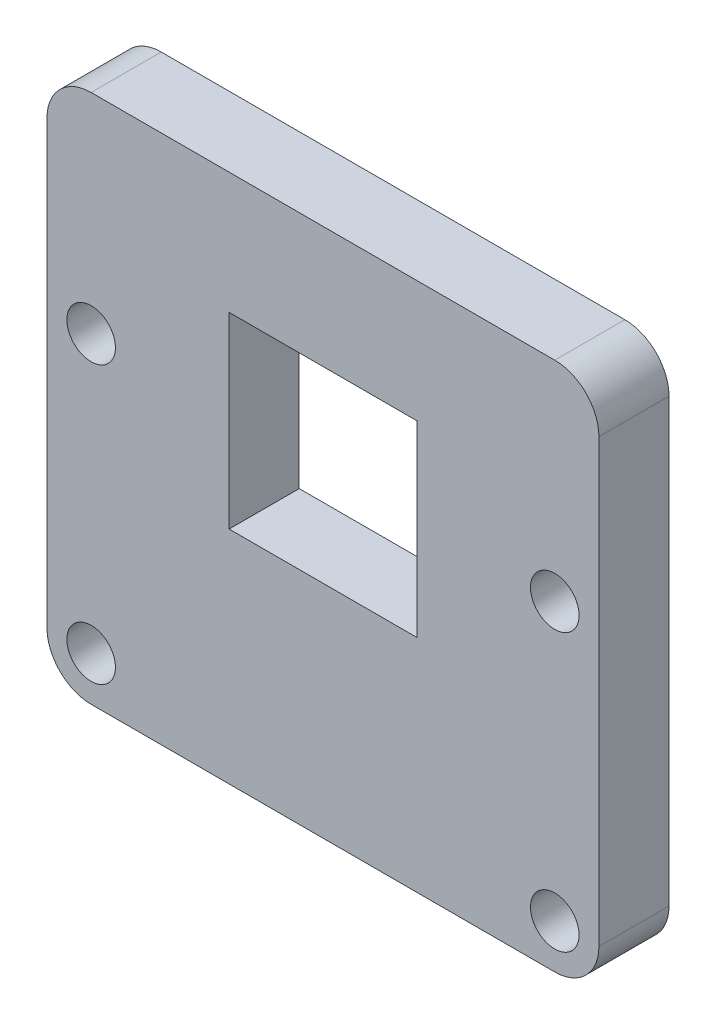
ISO-10303-21;
HEADER;
FILE_DESCRIPTION(('STEP AP214'),'2;1');
FILE_NAME('part.step','',(''),(''),'','','');
FILE_SCHEMA(('AUTOMOTIVE_DESIGN { 1 0 10303 214 1 1 1 1 }'));
ENDSEC;
DATA;
#1=APPLICATION_CONTEXT('core data for automotive mechanical design processes');
#2=APPLICATION_PROTOCOL_DEFINITION('international standard','automotive_design',2000,#1);
#3=PRODUCT_CONTEXT('',#1,'mechanical');
#4=PRODUCT('Part','Part','',(#3));
#5=PRODUCT_RELATED_PRODUCT_CATEGORY('part','',(#4));
#6=PRODUCT_DEFINITION_FORMATION('','',#4);
#7=PRODUCT_DEFINITION_CONTEXT('part definition',#1,'design');
#8=PRODUCT_DEFINITION('design','',#6,#7);
#9=PRODUCT_DEFINITION_SHAPE('','',#8);
#10=(LENGTH_UNIT() NAMED_UNIT(*) SI_UNIT(.MILLI.,.METRE.));
#11=(NAMED_UNIT(*) PLANE_ANGLE_UNIT() SI_UNIT($,.RADIAN.));
#12=(NAMED_UNIT(*) SI_UNIT($,.STERADIAN.) SOLID_ANGLE_UNIT());
#13=UNCERTAINTY_MEASURE_WITH_UNIT(LENGTH_MEASURE(1.E-05),#10,'distance_accuracy_value','');
#14=(GEOMETRIC_REPRESENTATION_CONTEXT(3) GLOBAL_UNCERTAINTY_ASSIGNED_CONTEXT((#13)) GLOBAL_UNIT_ASSIGNED_CONTEXT((#10,
#11,#12)) REPRESENTATION_CONTEXT('',''));
#15=CARTESIAN_POINT('',(0.,0.,0.));
#16=DIRECTION('',(0.,0.,1.));
#17=DIRECTION('',(1.,0.,0.));
#18=AXIS2_PLACEMENT_3D('',#15,#16,#17);
#19=CARTESIAN_POINT('',(-10.7053326435815,-14.9284893275787,-3.175));
#20=DIRECTION('',(0.,0.,1.));
#21=DIRECTION('',(1.,0.,0.));
#22=AXIS2_PLACEMENT_3D('',#19,#20,#21);
#23=CYLINDRICAL_SURFACE('',#22,2.);
#24=CARTESIAN_POINT('',(-10.7053326435815,-14.9284893275787,0.));
#25=DIRECTION('',(0.,0.,1.));
#26=DIRECTION('',(1.,0.,0.));
#27=AXIS2_PLACEMENT_3D('',#24,#25,#26);
#28=CIRCLE('',#27,2.);
#29=CARTESIAN_POINT('',(-12.7053326435815,-14.9284893275787,0.));
#30=VERTEX_POINT('',#29);
#31=CARTESIAN_POINT('',(-10.7053326435815,-16.9284893275787,0.));
#32=VERTEX_POINT('',#31);
#33=EDGE_CURVE('E206',#30,#32,#28,.T.);
#34=ORIENTED_EDGE('',*,*,#33,.F.);
#35=DIRECTION('',(0.,0.,1.));
#36=VECTOR('',#35,1.);
#37=CARTESIAN_POINT('',(-12.7053326435815,-14.9284893275787,-3.175));
#38=LINE('',#37,#36);
#39=CARTESIAN_POINT('',(-12.7053326435815,-14.9284893275787,-3.175));
#40=VERTEX_POINT('',#39);
#41=EDGE_CURVE('E11',#40,#30,#38,.T.);
#42=ORIENTED_EDGE('',*,*,#41,.F.);
#43=CARTESIAN_POINT('',(-10.7053326435815,-14.9284893275787,-3.175));
#44=DIRECTION('',(0.,0.,1.));
#45=DIRECTION('',(1.,0.,0.));
#46=AXIS2_PLACEMENT_3D('',#43,#44,#45);
#47=CIRCLE('',#46,2.);
#48=CARTESIAN_POINT('',(-10.7053326435815,-16.9284893275787,-3.175));
#49=VERTEX_POINT('',#48);
#50=EDGE_CURVE('E210',#40,#49,#47,.T.);
#51=ORIENTED_EDGE('',*,*,#50,.T.);
#52=DIRECTION('',(0.,0.,1.));
#53=VECTOR('',#52,1.);
#54=CARTESIAN_POINT('',(-10.7053326435815,-16.9284893275787,-3.175));
#55=LINE('',#54,#53);
#56=EDGE_CURVE('E42',#49,#32,#55,.T.);
#57=ORIENTED_EDGE('',*,*,#56,.T.);
#58=EDGE_LOOP('',(#34,#42,#51,#57));
#59=FACE_BOUND('',#58,.T.);
#60=ADVANCED_FACE('F39',(#59),#23,.T.);
#61=CARTESIAN_POINT('',(-12.7053326435815,5.07151067242124,-3.175));
#62=DIRECTION('',(-1.,0.,0.));
#63=DIRECTION('',(0.,-1.,0.));
#64=AXIS2_PLACEMENT_3D('',#61,#62,#63);
#65=PLANE('',#64);
#66=DIRECTION('',(0.,-1.,0.));
#67=VECTOR('',#66,1.);
#68=CARTESIAN_POINT('',(-12.7053326435815,5.07151067242124,0.));
#69=LINE('',#68,#67);
#70=CARTESIAN_POINT('',(-12.7053326435815,5.07151067242124,0.));
#71=VERTEX_POINT('',#70);
#72=EDGE_CURVE('E215',#71,#30,#69,.T.);
#73=ORIENTED_EDGE('',*,*,#72,.F.);
#74=DIRECTION('',(0.,0.,1.));
#75=VECTOR('',#74,1.);
#76=CARTESIAN_POINT('',(-12.7053326435815,5.07151067242124,-3.175));
#77=LINE('',#76,#75);
#78=CARTESIAN_POINT('',(-12.7053326435815,5.07151067242124,-3.175));
#79=VERTEX_POINT('',#78);
#80=EDGE_CURVE('E48',#79,#71,#77,.T.);
#81=ORIENTED_EDGE('',*,*,#80,.F.);
#82=DIRECTION('',(0.,-1.,0.));
#83=VECTOR('',#82,1.);
#84=CARTESIAN_POINT('',(-12.7053326435815,5.07151067242124,-3.175));
#85=LINE('',#84,#83);
#86=EDGE_CURVE('E239',#79,#40,#85,.T.);
#87=ORIENTED_EDGE('',*,*,#86,.T.);
#88=ORIENTED_EDGE('',*,*,#41,.T.);
#89=EDGE_LOOP('',(#73,#81,#87,#88));
#90=FACE_BOUND('',#89,.T.);
#91=ADVANCED_FACE('F302',(#90),#65,.T.);
#92=CARTESIAN_POINT('',(-10.7053326435815,5.07151067242125,-3.175));
#93=DIRECTION('',(0.,0.,1.));
#94=DIRECTION('',(1.,0.,0.));
#95=AXIS2_PLACEMENT_3D('',#92,#93,#94);
#96=CYLINDRICAL_SURFACE('',#95,2.);
#97=CARTESIAN_POINT('',(-10.7053326435815,5.07151067242125,0.));
#98=DIRECTION('',(0.,0.,1.));
#99=DIRECTION('',(1.,0.,0.));
#100=AXIS2_PLACEMENT_3D('',#97,#98,#99);
#101=CIRCLE('',#100,2.);
#102=CARTESIAN_POINT('',(-10.7053326435815,7.07151067242125,0.));
#103=VERTEX_POINT('',#102);
#104=EDGE_CURVE('E266',#103,#71,#101,.T.);
#105=ORIENTED_EDGE('',*,*,#104,.F.);
#106=DIRECTION('',(0.,0.,1.));
#107=VECTOR('',#106,1.);
#108=CARTESIAN_POINT('',(-10.7053326435815,7.07151067242125,-3.175));
#109=LINE('',#108,#107);
#110=CARTESIAN_POINT('',(-10.7053326435815,7.07151067242125,-3.175));
#111=VERTEX_POINT('',#110);
#112=EDGE_CURVE('E275',#111,#103,#109,.T.);
#113=ORIENTED_EDGE('',*,*,#112,.F.);
#114=CARTESIAN_POINT('',(-10.7053326435815,5.07151067242125,-3.175));
#115=DIRECTION('',(0.,0.,1.));
#116=DIRECTION('',(1.,0.,0.));
#117=AXIS2_PLACEMENT_3D('',#114,#115,#116);
#118=CIRCLE('',#117,2.);
#119=EDGE_CURVE('E235',#111,#79,#118,.T.);
#120=ORIENTED_EDGE('',*,*,#119,.T.);
#121=ORIENTED_EDGE('',*,*,#80,.T.);
#122=EDGE_LOOP('',(#105,#113,#120,#121));
#123=FACE_BOUND('',#122,.T.);
#124=ADVANCED_FACE('F322',(#123),#96,.T.);
#125=CARTESIAN_POINT('',(-10.7053326435815,7.07151067242125,-3.175));
#126=DIRECTION('',(0.,1.,0.));
#127=DIRECTION('',(0.,0.,1.));
#128=AXIS2_PLACEMENT_3D('',#125,#126,#127);
#129=PLANE('',#128);
#130=DIRECTION('',(-1.,0.,0.));
#131=VECTOR('',#130,1.);
#132=CARTESIAN_POINT('',(-10.7053326435815,7.07151067242125,0.));
#133=LINE('',#132,#131);
#134=CARTESIAN_POINT('',(10.2946673564185,7.07151067242125,0.));
#135=VERTEX_POINT('',#134);
#136=EDGE_CURVE('E262',#135,#103,#133,.T.);
#137=ORIENTED_EDGE('',*,*,#136,.F.);
#138=DIRECTION('',(0.,0.,1.));
#139=VECTOR('',#138,1.);
#140=CARTESIAN_POINT('',(10.2946673564185,7.07151067242125,-3.175));
#141=LINE('',#140,#139);
#142=CARTESIAN_POINT('',(10.2946673564185,7.07151067242125,-3.175));
#143=VERTEX_POINT('',#142);
#144=EDGE_CURVE('E278',#143,#135,#141,.T.);
#145=ORIENTED_EDGE('',*,*,#144,.F.);
#146=DIRECTION('',(-1.,0.,0.));
#147=VECTOR('',#146,1.);
#148=CARTESIAN_POINT('',(-10.7053326435815,7.07151067242125,-3.175));
#149=LINE('',#148,#147);
#150=EDGE_CURVE('E231',#143,#111,#149,.T.);
#151=ORIENTED_EDGE('',*,*,#150,.T.);
#152=ORIENTED_EDGE('',*,*,#112,.T.);
#153=EDGE_LOOP('',(#137,#145,#151,#152));
#154=FACE_BOUND('',#153,.T.);
#155=ADVANCED_FACE('F320',(#154),#129,.T.);
#156=CARTESIAN_POINT('',(10.2946673564185,5.07151067242125,-3.175));
#157=DIRECTION('',(0.,0.,1.));
#158=DIRECTION('',(1.,0.,0.));
#159=AXIS2_PLACEMENT_3D('',#156,#157,#158);
#160=CYLINDRICAL_SURFACE('',#159,2.);
#161=CARTESIAN_POINT('',(10.2946673564185,5.07151067242125,0.));
#162=DIRECTION('',(0.,0.,1.));
#163=DIRECTION('',(-1.,0.,0.));
#164=AXIS2_PLACEMENT_3D('',#161,#162,#163);
#165=CIRCLE('',#164,2.);
#166=CARTESIAN_POINT('',(12.2946673564185,5.07151067242124,0.));
#167=VERTEX_POINT('',#166);
#168=EDGE_CURVE('E258',#167,#135,#165,.T.);
#169=ORIENTED_EDGE('',*,*,#168,.F.);
#170=DIRECTION('',(0.,0.,1.));
#171=VECTOR('',#170,1.);
#172=CARTESIAN_POINT('',(12.2946673564185,5.07151067242124,-3.175));
#173=LINE('',#172,#171);
#174=CARTESIAN_POINT('',(12.2946673564185,5.07151067242124,-3.175));
#175=VERTEX_POINT('',#174);
#176=EDGE_CURVE('E281',#175,#167,#173,.T.);
#177=ORIENTED_EDGE('',*,*,#176,.F.);
#178=CARTESIAN_POINT('',(10.2946673564185,5.07151067242125,-3.175));
#179=DIRECTION('',(0.,0.,1.));
#180=DIRECTION('',(-1.,0.,0.));
#181=AXIS2_PLACEMENT_3D('',#178,#179,#180);
#182=CIRCLE('',#181,2.);
#183=EDGE_CURVE('E227',#175,#143,#182,.T.);
#184=ORIENTED_EDGE('',*,*,#183,.T.);
#185=ORIENTED_EDGE('',*,*,#144,.T.);
#186=EDGE_LOOP('',(#169,#177,#184,#185));
#187=FACE_BOUND('',#186,.T.);
#188=ADVANCED_FACE('F316',(#187),#160,.T.);
#189=CARTESIAN_POINT('',(12.2946673564185,5.07151067242124,-3.175));
#190=DIRECTION('',(1.,0.,0.));
#191=DIRECTION('',(0.,1.,0.));
#192=AXIS2_PLACEMENT_3D('',#189,#190,#191);
#193=PLANE('',#192);
#194=DIRECTION('',(0.,1.,0.));
#195=VECTOR('',#194,1.);
#196=CARTESIAN_POINT('',(12.2946673564185,5.07151067242124,0.));
#197=LINE('',#196,#195);
#198=CARTESIAN_POINT('',(12.2946673564185,-14.9284893275787,0.));
#199=VERTEX_POINT('',#198);
#200=EDGE_CURVE('E254',#199,#167,#197,.T.);
#201=ORIENTED_EDGE('',*,*,#200,.F.);
#202=DIRECTION('',(0.,0.,1.));
#203=VECTOR('',#202,1.);
#204=CARTESIAN_POINT('',(12.2946673564185,-14.9284893275787,-3.175));
#205=LINE('',#204,#203);
#206=CARTESIAN_POINT('',(12.2946673564185,-14.9284893275787,-3.175));
#207=VERTEX_POINT('',#206);
#208=EDGE_CURVE('E284',#207,#199,#205,.T.);
#209=ORIENTED_EDGE('',*,*,#208,.F.);
#210=DIRECTION('',(0.,1.,0.));
#211=VECTOR('',#210,1.);
#212=CARTESIAN_POINT('',(12.2946673564185,5.07151067242124,-3.175));
#213=LINE('',#212,#211);
#214=EDGE_CURVE('E223',#207,#175,#213,.T.);
#215=ORIENTED_EDGE('',*,*,#214,.T.);
#216=ORIENTED_EDGE('',*,*,#176,.T.);
#217=EDGE_LOOP('',(#201,#209,#215,#216));
#218=FACE_BOUND('',#217,.T.);
#219=ADVANCED_FACE('F314',(#218),#193,.T.);
#220=CARTESIAN_POINT('',(10.2946673564185,-14.9284893275787,-3.175));
#221=DIRECTION('',(0.,0.,1.));
#222=DIRECTION('',(1.,0.,0.));
#223=AXIS2_PLACEMENT_3D('',#220,#221,#222);
#224=CYLINDRICAL_SURFACE('',#223,2.);
#225=CARTESIAN_POINT('',(10.2946673564185,-14.9284893275787,0.));
#226=DIRECTION('',(0.,0.,1.));
#227=DIRECTION('',(1.,0.,0.));
#228=AXIS2_PLACEMENT_3D('',#225,#226,#227);
#229=CIRCLE('',#228,2.);
#230=CARTESIAN_POINT('',(10.2946673564185,-16.9284893275787,0.));
#231=VERTEX_POINT('',#230);
#232=EDGE_CURVE('E250',#231,#199,#229,.T.);
#233=ORIENTED_EDGE('',*,*,#232,.F.);
#234=DIRECTION('',(0.,0.,1.));
#235=VECTOR('',#234,1.);
#236=CARTESIAN_POINT('',(10.2946673564185,-16.9284893275787,-3.175));
#237=LINE('',#236,#235);
#238=CARTESIAN_POINT('',(10.2946673564185,-16.9284893275787,-3.175));
#239=VERTEX_POINT('',#238);
#240=EDGE_CURVE('E286',#239,#231,#237,.T.);
#241=ORIENTED_EDGE('',*,*,#240,.F.);
#242=CARTESIAN_POINT('',(10.2946673564185,-14.9284893275787,-3.175));
#243=DIRECTION('',(0.,0.,1.));
#244=DIRECTION('',(1.,0.,0.));
#245=AXIS2_PLACEMENT_3D('',#242,#243,#244);
#246=CIRCLE('',#245,2.);
#247=EDGE_CURVE('E219',#239,#207,#246,.T.);
#248=ORIENTED_EDGE('',*,*,#247,.T.);
#249=ORIENTED_EDGE('',*,*,#208,.T.);
#250=EDGE_LOOP('',(#233,#241,#248,#249));
#251=FACE_BOUND('',#250,.T.);
#252=ADVANCED_FACE('F310',(#251),#224,.T.);
#253=CARTESIAN_POINT('',(-10.7053326435815,-16.9284893275787,-3.175));
#254=DIRECTION('',(0.,-1.,0.));
#255=DIRECTION('',(0.,0.,-1.));
#256=AXIS2_PLACEMENT_3D('',#253,#254,#255);
#257=PLANE('',#256);
#258=DIRECTION('',(1.,0.,0.));
#259=VECTOR('',#258,1.);
#260=CARTESIAN_POINT('',(-10.7053326435815,-16.9284893275787,0.));
#261=LINE('',#260,#259);
#262=EDGE_CURVE('E246',#32,#231,#261,.T.);
#263=ORIENTED_EDGE('',*,*,#262,.F.);
#264=ORIENTED_EDGE('',*,*,#56,.F.);
#265=DIRECTION('',(1.,0.,0.));
#266=VECTOR('',#265,1.);
#267=CARTESIAN_POINT('',(-10.7053326435815,-16.9284893275787,-3.175));
#268=LINE('',#267,#266);
#269=EDGE_CURVE('E214',#49,#239,#268,.T.);
#270=ORIENTED_EDGE('',*,*,#269,.T.);
#271=ORIENTED_EDGE('',*,*,#240,.T.);
#272=EDGE_LOOP('',(#263,#264,#270,#271));
#273=FACE_BOUND('',#272,.T.);
#274=ADVANCED_FACE('F296',(#273),#257,.T.);
#275=CARTESIAN_POINT('',(-10.7053326435815,-14.9284893275787,-3.175));
#276=DIRECTION('',(0.,0.,1.));
#277=DIRECTION('',(1.,0.,0.));
#278=AXIS2_PLACEMENT_3D('',#275,#276,#277);
#279=PLANE('',#278);
#280=DIRECTION('',(-1.,0.,0.));
#281=VECTOR('',#280,1.);
#282=CARTESIAN_POINT('',(-4.45533264358149,1.57151067242125,-3.175));
#283=LINE('',#282,#281);
#284=CARTESIAN_POINT('',(4.04466735641851,1.57151067242125,-3.175));
#285=VERTEX_POINT('',#284);
#286=CARTESIAN_POINT('',(-4.45533264358149,1.57151067242125,-3.175));
#287=VERTEX_POINT('',#286);
#288=EDGE_CURVE('E138',#285,#287,#283,.T.);
#289=ORIENTED_EDGE('',*,*,#288,.T.);
#290=DIRECTION('',(0.,-1.,0.));
#291=VECTOR('',#290,1.);
#292=CARTESIAN_POINT('',(-4.45533264358149,1.57151067242125,-3.175));
#293=LINE('',#292,#291);
#294=CARTESIAN_POINT('',(-4.45533264358149,-6.92848932757875,-3.175));
#295=VERTEX_POINT('',#294);
#296=EDGE_CURVE('E131',#287,#295,#293,.T.);
#297=ORIENTED_EDGE('',*,*,#296,.T.);
#298=DIRECTION('',(1.,0.,0.));
#299=VECTOR('',#298,1.);
#300=CARTESIAN_POINT('',(-4.45533264358149,-6.92848932757875,-3.175));
#301=LINE('',#300,#299);
#302=CARTESIAN_POINT('',(4.04466735641851,-6.92848932757875,-3.175));
#303=VERTEX_POINT('',#302);
#304=EDGE_CURVE('E141',#295,#303,#301,.T.);
#305=ORIENTED_EDGE('',*,*,#304,.T.);
#306=DIRECTION('',(0.,1.,0.));
#307=VECTOR('',#306,1.);
#308=CARTESIAN_POINT('',(4.04466735641851,1.57151067242125,-3.175));
#309=LINE('',#308,#307);
#310=EDGE_CURVE('E56',#303,#285,#309,.T.);
#311=ORIENTED_EDGE('',*,*,#310,.T.);
#312=EDGE_LOOP('',(#289,#297,#305,#311));
#313=FACE_BOUND('',#312,.T.);
#314=CARTESIAN_POINT('',(10.2946673564185,-14.9284893275787,-3.175));
#315=DIRECTION('',(0.,0.,1.));
#316=DIRECTION('',(1.,0.,0.));
#317=AXIS2_PLACEMENT_3D('',#314,#315,#316);
#318=CIRCLE('',#317,1.1);
#319=CARTESIAN_POINT('',(11.3946673564185,-14.9284893275787,-3.175));
#320=VERTEX_POINT('',#319);
#321=EDGE_CURVE('E178',#320,#320,#318,.T.);
#322=ORIENTED_EDGE('',*,*,#321,.T.);
#323=EDGE_LOOP('',(#322));
#324=FACE_BOUND('',#323,.T.);
#325=CARTESIAN_POINT('',(10.2946673564185,-2.39048932757875,-3.175));
#326=DIRECTION('',(0.,0.,1.));
#327=DIRECTION('',(1.,0.,0.));
#328=AXIS2_PLACEMENT_3D('',#325,#326,#327);
#329=CIRCLE('',#328,1.1);
#330=CARTESIAN_POINT('',(11.3946673564185,-2.39048932757875,-3.175));
#331=VERTEX_POINT('',#330);
#332=EDGE_CURVE('E186',#331,#331,#329,.T.);
#333=ORIENTED_EDGE('',*,*,#332,.T.);
#334=EDGE_LOOP('',(#333));
#335=FACE_BOUND('',#334,.T.);
#336=CARTESIAN_POINT('',(-10.7053326435815,-2.39048932757875,-3.175));
#337=DIRECTION('',(0.,0.,1.));
#338=DIRECTION('',(1.,0.,0.));
#339=AXIS2_PLACEMENT_3D('',#336,#337,#338);
#340=CIRCLE('',#339,1.1);
#341=CARTESIAN_POINT('',(-9.60533264358149,-2.39048932757875,-3.175));
#342=VERTEX_POINT('',#341);
#343=EDGE_CURVE('E194',#342,#342,#340,.T.);
#344=ORIENTED_EDGE('',*,*,#343,.T.);
#345=EDGE_LOOP('',(#344));
#346=FACE_BOUND('',#345,.T.);
#347=CARTESIAN_POINT('',(-10.7053326435815,-14.9284893275787,-3.175));
#348=DIRECTION('',(0.,0.,1.));
#349=DIRECTION('',(1.,0.,0.));
#350=AXIS2_PLACEMENT_3D('',#347,#348,#349);
#351=CIRCLE('',#350,1.1);
#352=CARTESIAN_POINT('',(-9.60533264358149,-14.9284893275787,-3.175));
#353=VERTEX_POINT('',#352);
#354=EDGE_CURVE('E202',#353,#353,#351,.T.);
#355=ORIENTED_EDGE('',*,*,#354,.T.);
#356=EDGE_LOOP('',(#355));
#357=FACE_BOUND('',#356,.T.);
#358=ORIENTED_EDGE('',*,*,#50,.F.);
#359=ORIENTED_EDGE('',*,*,#86,.F.);
#360=ORIENTED_EDGE('',*,*,#119,.F.);
#361=ORIENTED_EDGE('',*,*,#150,.F.);
#362=ORIENTED_EDGE('',*,*,#183,.F.);
#363=ORIENTED_EDGE('',*,*,#214,.F.);
#364=ORIENTED_EDGE('',*,*,#247,.F.);
#365=ORIENTED_EDGE('',*,*,#269,.F.);
#366=EDGE_LOOP('',(#358,#359,#360,#361,#362,#363,#364,#365));
#367=FACE_BOUND('',#366,.T.);
#368=ADVANCED_FACE('F146',(#313,#324,#335,#346,#357,#367),#279,.F.);
#369=CARTESIAN_POINT('',(-10.7053326435815,-14.9284893275787,0.));
#370=DIRECTION('',(0.,0.,1.));
#371=DIRECTION('',(1.,0.,0.));
#372=AXIS2_PLACEMENT_3D('',#369,#370,#371);
#373=PLANE('',#372);
#374=DIRECTION('',(0.,-1.,0.));
#375=VECTOR('',#374,1.);
#376=CARTESIAN_POINT('',(-4.45533264358149,1.57151067242125,0.));
#377=LINE('',#376,#375);
#378=CARTESIAN_POINT('',(-4.45533264358149,1.57151067242125,0.));
#379=VERTEX_POINT('',#378);
#380=CARTESIAN_POINT('',(-4.45533264358149,-6.92848932757875,0.));
#381=VERTEX_POINT('',#380);
#382=EDGE_CURVE('E64',#379,#381,#377,.T.);
#383=ORIENTED_EDGE('',*,*,#382,.F.);
#384=DIRECTION('',(-1.,0.,0.));
#385=VECTOR('',#384,1.);
#386=CARTESIAN_POINT('',(-4.45533264358149,1.57151067242125,0.));
#387=LINE('',#386,#385);
#388=CARTESIAN_POINT('',(4.04466735641851,1.57151067242125,0.));
#389=VERTEX_POINT('',#388);
#390=EDGE_CURVE('E150',#389,#379,#387,.T.);
#391=ORIENTED_EDGE('',*,*,#390,.F.);
#392=DIRECTION('',(0.,1.,0.));
#393=VECTOR('',#392,1.);
#394=CARTESIAN_POINT('',(4.04466735641851,1.57151067242125,0.));
#395=LINE('',#394,#393);
#396=CARTESIAN_POINT('',(4.04466735641851,-6.92848932757875,0.));
#397=VERTEX_POINT('',#396);
#398=EDGE_CURVE('E154',#397,#389,#395,.T.);
#399=ORIENTED_EDGE('',*,*,#398,.F.);
#400=DIRECTION('',(1.,0.,0.));
#401=VECTOR('',#400,1.);
#402=CARTESIAN_POINT('',(-4.45533264358149,-6.92848932757875,0.));
#403=LINE('',#402,#401);
#404=EDGE_CURVE('E163',#381,#397,#403,.T.);
#405=ORIENTED_EDGE('',*,*,#404,.F.);
#406=EDGE_LOOP('',(#383,#391,#399,#405));
#407=FACE_BOUND('',#406,.T.);
#408=CARTESIAN_POINT('',(10.2946673564185,-14.9284893275787,0.));
#409=DIRECTION('',(0.,0.,1.));
#410=DIRECTION('',(1.,0.,0.));
#411=AXIS2_PLACEMENT_3D('',#408,#409,#410);
#412=CIRCLE('',#411,1.1);
#413=CARTESIAN_POINT('',(11.3946673564185,-14.9284893275787,0.));
#414=VERTEX_POINT('',#413);
#415=EDGE_CURVE('E172',#414,#414,#412,.T.);
#416=ORIENTED_EDGE('',*,*,#415,.F.);
#417=EDGE_LOOP('',(#416));
#418=FACE_BOUND('',#417,.T.);
#419=CARTESIAN_POINT('',(10.2946673564185,-2.39048932757875,0.));
#420=DIRECTION('',(0.,0.,1.));
#421=DIRECTION('',(1.,0.,0.));
#422=AXIS2_PLACEMENT_3D('',#419,#420,#421);
#423=CIRCLE('',#422,1.1);
#424=CARTESIAN_POINT('',(11.3946673564185,-2.39048932757875,0.));
#425=VERTEX_POINT('',#424);
#426=EDGE_CURVE('E182',#425,#425,#423,.T.);
#427=ORIENTED_EDGE('',*,*,#426,.F.);
#428=EDGE_LOOP('',(#427));
#429=FACE_BOUND('',#428,.T.);
#430=CARTESIAN_POINT('',(-10.7053326435815,-2.39048932757875,0.));
#431=DIRECTION('',(0.,0.,1.));
#432=DIRECTION('',(1.,0.,0.));
#433=AXIS2_PLACEMENT_3D('',#430,#431,#432);
#434=CIRCLE('',#433,1.1);
#435=CARTESIAN_POINT('',(-9.60533264358149,-2.39048932757875,0.));
#436=VERTEX_POINT('',#435);
#437=EDGE_CURVE('E190',#436,#436,#434,.T.);
#438=ORIENTED_EDGE('',*,*,#437,.F.);
#439=EDGE_LOOP('',(#438));
#440=FACE_BOUND('',#439,.T.);
#441=CARTESIAN_POINT('',(-10.7053326435815,-14.9284893275787,0.));
#442=DIRECTION('',(0.,0.,1.));
#443=DIRECTION('',(1.,0.,0.));
#444=AXIS2_PLACEMENT_3D('',#441,#442,#443);
#445=CIRCLE('',#444,1.1);
#446=CARTESIAN_POINT('',(-9.60533264358149,-14.9284893275787,0.));
#447=VERTEX_POINT('',#446);
#448=EDGE_CURVE('E198',#447,#447,#445,.T.);
#449=ORIENTED_EDGE('',*,*,#448,.F.);
#450=EDGE_LOOP('',(#449));
#451=FACE_BOUND('',#450,.T.);
#452=ORIENTED_EDGE('',*,*,#33,.T.);
#453=ORIENTED_EDGE('',*,*,#262,.T.);
#454=ORIENTED_EDGE('',*,*,#232,.T.);
#455=ORIENTED_EDGE('',*,*,#200,.T.);
#456=ORIENTED_EDGE('',*,*,#168,.T.);
#457=ORIENTED_EDGE('',*,*,#136,.T.);
#458=ORIENTED_EDGE('',*,*,#104,.T.);
#459=ORIENTED_EDGE('',*,*,#72,.T.);
#460=EDGE_LOOP('',(#452,#453,#454,#455,#456,#457,#458,#459));
#461=FACE_BOUND('',#460,.T.);
#462=ADVANCED_FACE('F298',(#407,#418,#429,#440,#451,#461),#373,.T.);
#463=CARTESIAN_POINT('',(-10.7053326435815,-14.9284893275787,-3.175));
#464=DIRECTION('',(0.,0.,1.));
#465=DIRECTION('',(1.,0.,0.));
#466=AXIS2_PLACEMENT_3D('',#463,#464,#465);
#467=CYLINDRICAL_SURFACE('',#466,1.1);
#468=ORIENTED_EDGE('',*,*,#354,.F.);
#469=EDGE_LOOP('',(#468));
#470=FACE_BOUND('',#469,.T.);
#471=ORIENTED_EDGE('',*,*,#448,.T.);
#472=EDGE_LOOP('',(#471));
#473=FACE_BOUND('',#472,.T.);
#474=ADVANCED_FACE('F396',(#470,#473),#467,.F.);
#475=CARTESIAN_POINT('',(-10.7053326435815,-2.39048932757875,-3.175));
#476=DIRECTION('',(0.,0.,1.));
#477=DIRECTION('',(1.,0.,0.));
#478=AXIS2_PLACEMENT_3D('',#475,#476,#477);
#479=CYLINDRICAL_SURFACE('',#478,1.1);
#480=ORIENTED_EDGE('',*,*,#343,.F.);
#481=EDGE_LOOP('',(#480));
#482=FACE_BOUND('',#481,.T.);
#483=ORIENTED_EDGE('',*,*,#437,.T.);
#484=EDGE_LOOP('',(#483));
#485=FACE_BOUND('',#484,.T.);
#486=ADVANCED_FACE('F406',(#482,#485),#479,.F.);
#487=CARTESIAN_POINT('',(10.2946673564185,-2.39048932757875,-3.175));
#488=DIRECTION('',(0.,0.,1.));
#489=DIRECTION('',(1.,0.,0.));
#490=AXIS2_PLACEMENT_3D('',#487,#488,#489);
#491=CYLINDRICAL_SURFACE('',#490,1.1);
#492=ORIENTED_EDGE('',*,*,#332,.F.);
#493=EDGE_LOOP('',(#492));
#494=FACE_BOUND('',#493,.T.);
#495=ORIENTED_EDGE('',*,*,#426,.T.);
#496=EDGE_LOOP('',(#495));
#497=FACE_BOUND('',#496,.T.);
#498=ADVANCED_FACE('F416',(#494,#497),#491,.F.);
#499=CARTESIAN_POINT('',(10.2946673564185,-14.9284893275787,-3.175));
#500=DIRECTION('',(0.,0.,1.));
#501=DIRECTION('',(1.,0.,0.));
#502=AXIS2_PLACEMENT_3D('',#499,#500,#501);
#503=CYLINDRICAL_SURFACE('',#502,1.1);
#504=ORIENTED_EDGE('',*,*,#321,.F.);
#505=EDGE_LOOP('',(#504));
#506=FACE_BOUND('',#505,.T.);
#507=ORIENTED_EDGE('',*,*,#415,.T.);
#508=EDGE_LOOP('',(#507));
#509=FACE_BOUND('',#508,.T.);
#510=ADVANCED_FACE('F426',(#506,#509),#503,.F.);
#511=CARTESIAN_POINT('',(-4.45533264358149,1.57151067242125,-3.175));
#512=DIRECTION('',(-1.,0.,0.));
#513=DIRECTION('',(0.,-1.,0.));
#514=AXIS2_PLACEMENT_3D('',#511,#512,#513);
#515=PLANE('',#514);
#516=ORIENTED_EDGE('',*,*,#382,.T.);
#517=DIRECTION('',(0.,0.,1.));
#518=VECTOR('',#517,1.);
#519=CARTESIAN_POINT('',(-4.45533264358149,-6.92848932757875,-3.175));
#520=LINE('',#519,#518);
#521=EDGE_CURVE('E127',#295,#381,#520,.T.);
#522=ORIENTED_EDGE('',*,*,#521,.F.);
#523=ORIENTED_EDGE('',*,*,#296,.F.);
#524=DIRECTION('',(0.,0.,1.));
#525=VECTOR('',#524,1.);
#526=CARTESIAN_POINT('',(-4.45533264358149,1.57151067242125,-3.175));
#527=LINE('',#526,#525);
#528=EDGE_CURVE('E169',#287,#379,#527,.T.);
#529=ORIENTED_EDGE('',*,*,#528,.T.);
#530=EDGE_LOOP('',(#516,#522,#523,#529));
#531=FACE_BOUND('',#530,.T.);
#532=ADVANCED_FACE('F129',(#531),#515,.F.);
#533=CARTESIAN_POINT('',(-4.45533264358149,1.57151067242125,-3.175));
#534=DIRECTION('',(0.,1.,0.));
#535=DIRECTION('',(-1.,0.,0.));
#536=AXIS2_PLACEMENT_3D('',#533,#534,#535);
#537=PLANE('',#536);
#538=ORIENTED_EDGE('',*,*,#390,.T.);
#539=ORIENTED_EDGE('',*,*,#528,.F.);
#540=ORIENTED_EDGE('',*,*,#288,.F.);
#541=DIRECTION('',(0.,0.,1.));
#542=VECTOR('',#541,1.);
#543=CARTESIAN_POINT('',(4.04466735641851,1.57151067242125,-3.175));
#544=LINE('',#543,#542);
#545=EDGE_CURVE('E173',#285,#389,#544,.T.);
#546=ORIENTED_EDGE('',*,*,#545,.T.);
#547=EDGE_LOOP('',(#538,#539,#540,#546));
#548=FACE_BOUND('',#547,.T.);
#549=ADVANCED_FACE('F445',(#548),#537,.F.);
#550=CARTESIAN_POINT('',(4.04466735641851,1.57151067242125,-3.175));
#551=DIRECTION('',(1.,0.,0.));
#552=DIRECTION('',(0.,1.,0.));
#553=AXIS2_PLACEMENT_3D('',#550,#551,#552);
#554=PLANE('',#553);
#555=ORIENTED_EDGE('',*,*,#398,.T.);
#556=ORIENTED_EDGE('',*,*,#545,.F.);
#557=ORIENTED_EDGE('',*,*,#310,.F.);
#558=DIRECTION('',(0.,0.,1.));
#559=VECTOR('',#558,1.);
#560=CARTESIAN_POINT('',(4.04466735641851,-6.92848932757875,-3.175));
#561=LINE('',#560,#559);
#562=EDGE_CURVE('E137',#303,#397,#561,.T.);
#563=ORIENTED_EDGE('',*,*,#562,.T.);
#564=EDGE_LOOP('',(#555,#556,#557,#563));
#565=FACE_BOUND('',#564,.T.);
#566=ADVANCED_FACE('F454',(#565),#554,.F.);
#567=CARTESIAN_POINT('',(-4.45533264358149,-6.92848932757875,-3.175));
#568=DIRECTION('',(0.,-1.,0.));
#569=DIRECTION('',(1.,0.,0.));
#570=AXIS2_PLACEMENT_3D('',#567,#568,#569);
#571=PLANE('',#570);
#572=ORIENTED_EDGE('',*,*,#404,.T.);
#573=ORIENTED_EDGE('',*,*,#562,.F.);
#574=ORIENTED_EDGE('',*,*,#304,.F.);
#575=ORIENTED_EDGE('',*,*,#521,.T.);
#576=EDGE_LOOP('',(#572,#573,#574,#575));
#577=FACE_BOUND('',#576,.T.);
#578=ADVANCED_FACE('F142',(#577),#571,.F.);
#579=CLOSED_SHELL('',(#60,#91,#124,#155,#188,#219,#252,#274,#368,#462,#474,#486,#498,#510,#532,
#549,#566,#578));
#580=MANIFOLD_SOLID_BREP('B2',#579);
#581=ADVANCED_BREP_SHAPE_REPRESENTATION('',(#18,#580),#14);
#582=SHAPE_DEFINITION_REPRESENTATION(#9,#581);
ENDSEC;
END-ISO-10303-21;
